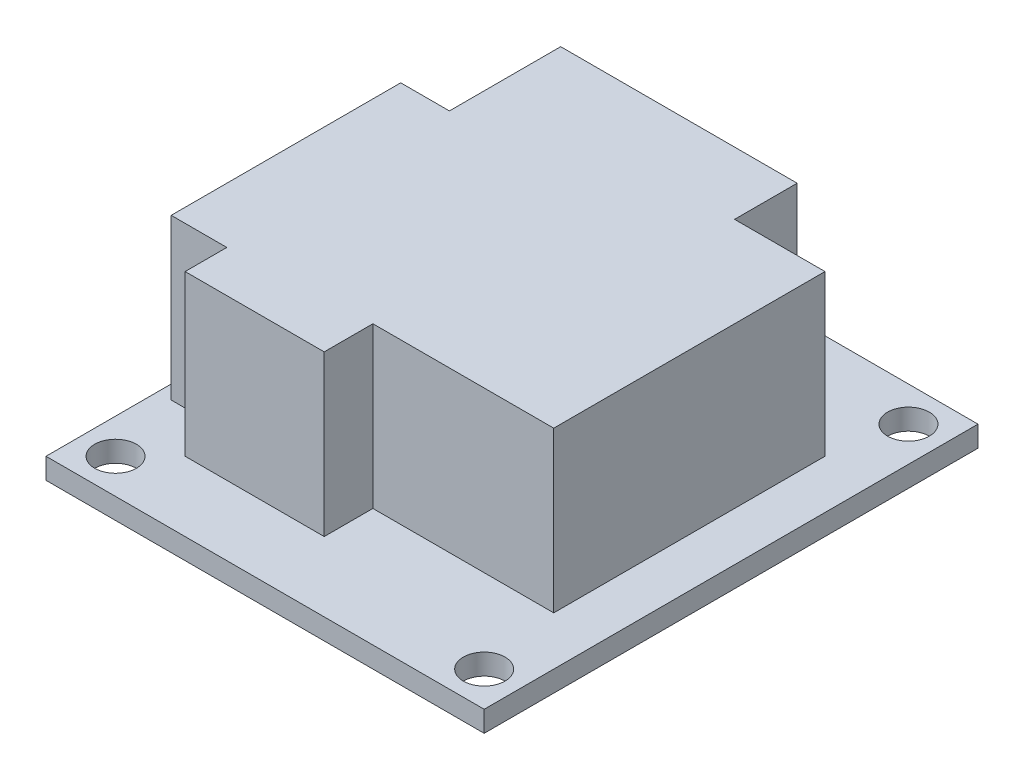
ISO-10303-21;
HEADER;
FILE_DESCRIPTION(('STEP AP214'),'2;1');
FILE_NAME('part.step','',(''),(''),'','','');
FILE_SCHEMA(('AUTOMOTIVE_DESIGN { 1 0 10303 214 1 1 1 1 }'));
ENDSEC;
DATA;
#1=APPLICATION_CONTEXT('core data for automotive mechanical design processes');
#2=APPLICATION_PROTOCOL_DEFINITION('international standard','automotive_design',2000,#1);
#3=PRODUCT_CONTEXT('',#1,'mechanical');
#4=PRODUCT('Part','Part','',(#3));
#5=PRODUCT_RELATED_PRODUCT_CATEGORY('part','',(#4));
#6=PRODUCT_DEFINITION_FORMATION('','',#4);
#7=PRODUCT_DEFINITION_CONTEXT('part definition',#1,'design');
#8=PRODUCT_DEFINITION('design','',#6,#7);
#9=PRODUCT_DEFINITION_SHAPE('','',#8);
#10=(LENGTH_UNIT() NAMED_UNIT(*) SI_UNIT(.MILLI.,.METRE.));
#11=(NAMED_UNIT(*) PLANE_ANGLE_UNIT() SI_UNIT($,.RADIAN.));
#12=(NAMED_UNIT(*) SI_UNIT($,.STERADIAN.) SOLID_ANGLE_UNIT());
#13=UNCERTAINTY_MEASURE_WITH_UNIT(LENGTH_MEASURE(1.E-05),#10,'distance_accuracy_value','');
#14=(GEOMETRIC_REPRESENTATION_CONTEXT(3) GLOBAL_UNCERTAINTY_ASSIGNED_CONTEXT((#13)) GLOBAL_UNIT_ASSIGNED_CONTEXT((#10,
#11,#12)) REPRESENTATION_CONTEXT('',''));
#15=CARTESIAN_POINT('',(0.,0.,0.));
#16=DIRECTION('',(0.,0.,1.));
#17=DIRECTION('',(1.,0.,0.));
#18=AXIS2_PLACEMENT_3D('',#15,#16,#17);
#19=CARTESIAN_POINT('',(0.,0.,0.));
#20=DIRECTION('',(0.,1.,0.));
#21=DIRECTION('',(0.,0.,1.));
#22=AXIS2_PLACEMENT_3D('',#19,#20,#21);
#23=PLANE('',#22);
#24=DIRECTION('',(0.,0.,-1.));
#25=VECTOR('',#24,1.);
#26=CARTESIAN_POINT('',(-14.245744305368,0.,0.));
#27=LINE('',#26,#25);
#28=CARTESIAN_POINT('',(-14.245744305368,0.,45.3495673691751));
#29=VERTEX_POINT('',#28);
#30=CARTESIAN_POINT('',(-14.245744305368,0.,9.84956736917511));
#31=VERTEX_POINT('',#30);
#32=EDGE_CURVE('E470',#29,#31,#27,.T.);
#33=ORIENTED_EDGE('',*,*,#32,.T.);
#34=DIRECTION('',(-1.,0.,0.));
#35=VECTOR('',#34,1.);
#36=CARTESIAN_POINT('',(0.,0.,9.8495673691751));
#37=LINE('',#36,#35);
#38=CARTESIAN_POINT('',(17.254255694632,0.,9.84956736917509));
#39=VERTEX_POINT('',#38);
#40=EDGE_CURVE('E438',#39,#31,#37,.T.);
#41=ORIENTED_EDGE('',*,*,#40,.F.);
#42=DIRECTION('',(0.,0.,-1.));
#43=VECTOR('',#42,1.);
#44=CARTESIAN_POINT('',(17.254255694632,0.,0.));
#45=LINE('',#44,#43);
#46=CARTESIAN_POINT('',(17.254255694632,0.,45.3495673691751));
#47=VERTEX_POINT('',#46);
#48=EDGE_CURVE('E476',#47,#39,#45,.T.);
#49=ORIENTED_EDGE('',*,*,#48,.F.);
#50=DIRECTION('',(-1.,0.,0.));
#51=VECTOR('',#50,1.);
#52=CARTESIAN_POINT('',(0.,0.,45.3495673691751));
#53=LINE('',#52,#51);
#54=EDGE_CURVE('E473',#47,#29,#53,.T.);
#55=ORIENTED_EDGE('',*,*,#54,.T.);
#56=EDGE_LOOP('',(#33,#41,#49,#55));
#57=FACE_BOUND('',#56,.T.);
#58=CARTESIAN_POINT('',(14.754255694632,0.,12.3495673691751));
#59=DIRECTION('',(0.,1.,0.));
#60=DIRECTION('',(0.,0.,1.));
#61=AXIS2_PLACEMENT_3D('',#58,#59,#60);
#62=CIRCLE('',#61,1.5);
#63=CARTESIAN_POINT('',(14.754255694632,0.,13.8495673691751));
#64=VERTEX_POINT('',#63);
#65=EDGE_CURVE('E467',#64,#64,#62,.T.);
#66=ORIENTED_EDGE('',*,*,#65,.T.);
#67=EDGE_LOOP('',(#66));
#68=FACE_BOUND('',#67,.T.);
#69=CARTESIAN_POINT('',(-11.745744305368,0.,12.3495673691751));
#70=DIRECTION('',(0.,1.,0.));
#71=DIRECTION('',(0.,0.,1.));
#72=AXIS2_PLACEMENT_3D('',#69,#70,#71);
#73=CIRCLE('',#72,1.5);
#74=CARTESIAN_POINT('',(-11.745744305368,0.,13.8495673691751));
#75=VERTEX_POINT('',#74);
#76=EDGE_CURVE('E464',#75,#75,#73,.T.);
#77=ORIENTED_EDGE('',*,*,#76,.T.);
#78=EDGE_LOOP('',(#77));
#79=FACE_BOUND('',#78,.T.);
#80=CARTESIAN_POINT('',(-11.745744305368,0.,42.8495673691751));
#81=DIRECTION('',(0.,1.,0.));
#82=DIRECTION('',(0.,0.,1.));
#83=AXIS2_PLACEMENT_3D('',#80,#81,#82);
#84=CIRCLE('',#83,1.5);
#85=CARTESIAN_POINT('',(-11.745744305368,0.,44.3495673691751));
#86=VERTEX_POINT('',#85);
#87=EDGE_CURVE('E461',#86,#86,#84,.T.);
#88=ORIENTED_EDGE('',*,*,#87,.T.);
#89=EDGE_LOOP('',(#88));
#90=FACE_BOUND('',#89,.T.);
#91=CARTESIAN_POINT('',(14.754255694632,0.,42.8495673691751));
#92=DIRECTION('',(0.,1.,0.));
#93=DIRECTION('',(0.,0.,1.));
#94=AXIS2_PLACEMENT_3D('',#91,#92,#93);
#95=CIRCLE('',#94,1.5);
#96=CARTESIAN_POINT('',(14.754255694632,0.,44.3495673691751));
#97=VERTEX_POINT('',#96);
#98=EDGE_CURVE('E433',#97,#97,#95,.T.);
#99=ORIENTED_EDGE('',*,*,#98,.T.);
#100=EDGE_LOOP('',(#99));
#101=FACE_BOUND('',#100,.T.);
#102=DIRECTION('',(1.,0.,0.));
#103=VECTOR('',#102,1.);
#104=CARTESIAN_POINT('',(0.,0.,20.8495673691751));
#105=LINE('',#104,#103);
#106=CARTESIAN_POINT('',(-13.245744305368,0.,20.8495673691751));
#107=VERTEX_POINT('',#106);
#108=CARTESIAN_POINT('',(-9.745744305368,0.,20.8495673691751));
#109=VERTEX_POINT('',#108);
#110=EDGE_CURVE('E56',#107,#109,#105,.T.);
#111=ORIENTED_EDGE('',*,*,#110,.F.);
#112=DIRECTION('',(0.,0.,-1.));
#113=VECTOR('',#112,1.);
#114=CARTESIAN_POINT('',(-13.245744305368,0.,0.));
#115=LINE('',#114,#113);
#116=CARTESIAN_POINT('',(-13.245744305368,0.,37.3495673691751));
#117=VERTEX_POINT('',#116);
#118=EDGE_CURVE('E60',#117,#107,#115,.T.);
#119=ORIENTED_EDGE('',*,*,#118,.F.);
#120=DIRECTION('',(-1.,0.,0.));
#121=VECTOR('',#120,1.);
#122=CARTESIAN_POINT('',(0.,0.,37.3495673691751));
#123=LINE('',#122,#121);
#124=CARTESIAN_POINT('',(-9.245744305368,0.,37.3495673691751));
#125=VERTEX_POINT('',#124);
#126=EDGE_CURVE('E271',#125,#117,#123,.T.);
#127=ORIENTED_EDGE('',*,*,#126,.F.);
#128=DIRECTION('',(0.,0.,-1.));
#129=VECTOR('',#128,1.);
#130=CARTESIAN_POINT('',(-9.245744305368,0.,0.));
#131=LINE('',#130,#129);
#132=CARTESIAN_POINT('',(-9.245744305368,0.,40.3495673691751));
#133=VERTEX_POINT('',#132);
#134=EDGE_CURVE('E273',#133,#125,#131,.T.);
#135=ORIENTED_EDGE('',*,*,#134,.F.);
#136=DIRECTION('',(-1.,0.,0.));
#137=VECTOR('',#136,1.);
#138=CARTESIAN_POINT('',(0.,0.,40.3495673691751));
#139=LINE('',#138,#137);
#140=CARTESIAN_POINT('',(0.754255694631998,0.,40.3495673691751));
#141=VERTEX_POINT('',#140);
#142=EDGE_CURVE('E276',#141,#133,#139,.T.);
#143=ORIENTED_EDGE('',*,*,#142,.F.);
#144=DIRECTION('',(0.,0.,1.));
#145=VECTOR('',#144,1.);
#146=CARTESIAN_POINT('',(0.754255694631993,0.,0.));
#147=LINE('',#146,#145);
#148=CARTESIAN_POINT('',(0.754255694631998,0.,36.8495673691751));
#149=VERTEX_POINT('',#148);
#150=EDGE_CURVE('E279',#149,#141,#147,.T.);
#151=ORIENTED_EDGE('',*,*,#150,.F.);
#152=DIRECTION('',(-1.,0.,0.));
#153=VECTOR('',#152,1.);
#154=CARTESIAN_POINT('',(0.,0.,36.8495673691751));
#155=LINE('',#154,#153);
#156=CARTESIAN_POINT('',(13.754255694632,0.,36.8495673691751));
#157=VERTEX_POINT('',#156);
#158=EDGE_CURVE('E282',#157,#149,#155,.T.);
#159=ORIENTED_EDGE('',*,*,#158,.F.);
#160=DIRECTION('',(0.,0.,1.));
#161=VECTOR('',#160,1.);
#162=CARTESIAN_POINT('',(13.754255694632,0.,0.));
#163=LINE('',#162,#161);
#164=CARTESIAN_POINT('',(13.754255694632,0.,17.3495673691751));
#165=VERTEX_POINT('',#164);
#166=EDGE_CURVE('E285',#165,#157,#163,.T.);
#167=ORIENTED_EDGE('',*,*,#166,.F.);
#168=DIRECTION('',(1.,0.,0.));
#169=VECTOR('',#168,1.);
#170=CARTESIAN_POINT('',(0.,0.,17.3495673691751));
#171=LINE('',#170,#169);
#172=CARTESIAN_POINT('',(7.254255694632,0.,17.3495673691751));
#173=VERTEX_POINT('',#172);
#174=EDGE_CURVE('E288',#173,#165,#171,.T.);
#175=ORIENTED_EDGE('',*,*,#174,.F.);
#176=DIRECTION('',(0.,0.,1.));
#177=VECTOR('',#176,1.);
#178=CARTESIAN_POINT('',(7.254255694632,0.,0.));
#179=LINE('',#178,#177);
#180=CARTESIAN_POINT('',(7.254255694632,0.,12.8495673691751));
#181=VERTEX_POINT('',#180);
#182=EDGE_CURVE('E291',#181,#173,#179,.T.);
#183=ORIENTED_EDGE('',*,*,#182,.F.);
#184=DIRECTION('',(1.,0.,0.));
#185=VECTOR('',#184,1.);
#186=CARTESIAN_POINT('',(0.,0.,12.8495673691751));
#187=LINE('',#186,#185);
#188=CARTESIAN_POINT('',(-9.745744305368,0.,12.8495673691751));
#189=VERTEX_POINT('',#188);
#190=EDGE_CURVE('E248',#189,#181,#187,.T.);
#191=ORIENTED_EDGE('',*,*,#190,.F.);
#192=DIRECTION('',(0.,0.,-1.));
#193=VECTOR('',#192,1.);
#194=CARTESIAN_POINT('',(-9.745744305368,0.,0.));
#195=LINE('',#194,#193);
#196=EDGE_CURVE('E245',#109,#189,#195,.T.);
#197=ORIENTED_EDGE('',*,*,#196,.F.);
#198=EDGE_LOOP('',(#111,#119,#127,#135,#143,#151,#159,#167,#175,#183,#191,#197));
#199=FACE_BOUND('',#198,.T.);
#200=ADVANCED_FACE('F41',(#57,#68,#79,#90,#101,#199),#23,.F.);
#201=CARTESIAN_POINT('',(-14.245744305368,1.5,0.));
#202=DIRECTION('',(-1.,0.,0.));
#203=DIRECTION('',(0.,0.,1.));
#204=AXIS2_PLACEMENT_3D('',#201,#202,#203);
#205=PLANE('',#204);
#206=ORIENTED_EDGE('',*,*,#32,.F.);
#207=DIRECTION('',(0.,-1.,0.));
#208=VECTOR('',#207,1.);
#209=CARTESIAN_POINT('',(-14.245744305368,1.5,45.3495673691751));
#210=LINE('',#209,#208);
#211=CARTESIAN_POINT('',(-14.245744305368,1.5,45.3495673691751));
#212=VERTEX_POINT('',#211);
#213=EDGE_CURVE('E11',#212,#29,#210,.T.);
#214=ORIENTED_EDGE('',*,*,#213,.F.);
#215=DIRECTION('',(0.,0.,-1.));
#216=VECTOR('',#215,1.);
#217=CARTESIAN_POINT('',(-14.245744305368,1.5,0.));
#218=LINE('',#217,#216);
#219=CARTESIAN_POINT('',(-14.245744305368,1.5,9.84956736917511));
#220=VERTEX_POINT('',#219);
#221=EDGE_CURVE('E447',#212,#220,#218,.T.);
#222=ORIENTED_EDGE('',*,*,#221,.T.);
#223=DIRECTION('',(0.,-1.,0.));
#224=VECTOR('',#223,1.);
#225=CARTESIAN_POINT('',(-14.245744305368,1.5,9.84956736917511));
#226=LINE('',#225,#224);
#227=EDGE_CURVE('E458',#220,#31,#226,.T.);
#228=ORIENTED_EDGE('',*,*,#227,.T.);
#229=EDGE_LOOP('',(#206,#214,#222,#228));
#230=FACE_BOUND('',#229,.T.);
#231=ADVANCED_FACE('F498',(#230),#205,.T.);
#232=CARTESIAN_POINT('',(0.,1.5,45.3495673691751));
#233=DIRECTION('',(0.,0.,1.));
#234=DIRECTION('',(1.,0.,0.));
#235=AXIS2_PLACEMENT_3D('',#232,#233,#234);
#236=PLANE('',#235);
#237=ORIENTED_EDGE('',*,*,#54,.F.);
#238=DIRECTION('',(0.,-1.,0.));
#239=VECTOR('',#238,1.);
#240=CARTESIAN_POINT('',(17.254255694632,1.5,45.3495673691751));
#241=LINE('',#240,#239);
#242=CARTESIAN_POINT('',(17.254255694632,1.5,45.3495673691751));
#243=VERTEX_POINT('',#242);
#244=EDGE_CURVE('E49',#243,#47,#241,.T.);
#245=ORIENTED_EDGE('',*,*,#244,.F.);
#246=DIRECTION('',(-1.,0.,0.));
#247=VECTOR('',#246,1.);
#248=CARTESIAN_POINT('',(0.,1.5,45.3495673691751));
#249=LINE('',#248,#247);
#250=EDGE_CURVE('E450',#243,#212,#249,.T.);
#251=ORIENTED_EDGE('',*,*,#250,.T.);
#252=ORIENTED_EDGE('',*,*,#213,.T.);
#253=EDGE_LOOP('',(#237,#245,#251,#252));
#254=FACE_BOUND('',#253,.T.);
#255=ADVANCED_FACE('F494',(#254),#236,.T.);
#256=CARTESIAN_POINT('',(17.254255694632,1.5,0.));
#257=DIRECTION('',(-1.,0.,0.));
#258=DIRECTION('',(0.,0.,1.));
#259=AXIS2_PLACEMENT_3D('',#256,#257,#258);
#260=PLANE('',#259);
#261=ORIENTED_EDGE('',*,*,#48,.T.);
#262=DIRECTION('',(0.,-1.,0.));
#263=VECTOR('',#262,1.);
#264=CARTESIAN_POINT('',(17.254255694632,1.5,9.84956736917509));
#265=LINE('',#264,#263);
#266=CARTESIAN_POINT('',(17.254255694632,1.5,9.84956736917509));
#267=VERTEX_POINT('',#266);
#268=EDGE_CURVE('E482',#267,#39,#265,.T.);
#269=ORIENTED_EDGE('',*,*,#268,.F.);
#270=DIRECTION('',(0.,0.,-1.));
#271=VECTOR('',#270,1.);
#272=CARTESIAN_POINT('',(17.254255694632,1.5,0.));
#273=LINE('',#272,#271);
#274=EDGE_CURVE('E453',#243,#267,#273,.T.);
#275=ORIENTED_EDGE('',*,*,#274,.F.);
#276=ORIENTED_EDGE('',*,*,#244,.T.);
#277=EDGE_LOOP('',(#261,#269,#275,#276));
#278=FACE_BOUND('',#277,.T.);
#279=ADVANCED_FACE('F487',(#278),#260,.F.);
#280=CARTESIAN_POINT('',(14.754255694632,1.5,12.3495673691751));
#281=DIRECTION('',(0.,-1.,0.));
#282=DIRECTION('',(0.,0.,-1.));
#283=AXIS2_PLACEMENT_3D('',#280,#281,#282);
#284=CYLINDRICAL_SURFACE('',#283,1.5);
#285=CARTESIAN_POINT('',(14.754255694632,1.5,12.3495673691751));
#286=DIRECTION('',(0.,1.,0.));
#287=DIRECTION('',(0.,0.,1.));
#288=AXIS2_PLACEMENT_3D('',#285,#286,#287);
#289=CIRCLE('',#288,1.5);
#290=CARTESIAN_POINT('',(14.754255694632,1.5,13.8495673691751));
#291=VERTEX_POINT('',#290);
#292=EDGE_CURVE('E444',#291,#291,#289,.T.);
#293=ORIENTED_EDGE('',*,*,#292,.T.);
#294=EDGE_LOOP('',(#293));
#295=FACE_BOUND('',#294,.T.);
#296=ORIENTED_EDGE('',*,*,#65,.F.);
#297=EDGE_LOOP('',(#296));
#298=FACE_BOUND('',#297,.T.);
#299=ADVANCED_FACE('F528',(#295,#298),#284,.F.);
#300=CARTESIAN_POINT('',(-11.745744305368,1.5,12.3495673691751));
#301=DIRECTION('',(0.,-1.,0.));
#302=DIRECTION('',(0.,0.,-1.));
#303=AXIS2_PLACEMENT_3D('',#300,#301,#302);
#304=CYLINDRICAL_SURFACE('',#303,1.5);
#305=CARTESIAN_POINT('',(-11.745744305368,1.5,12.3495673691751));
#306=DIRECTION('',(0.,1.,0.));
#307=DIRECTION('',(0.,0.,1.));
#308=AXIS2_PLACEMENT_3D('',#305,#306,#307);
#309=CIRCLE('',#308,1.5);
#310=CARTESIAN_POINT('',(-11.745744305368,1.5,13.8495673691751));
#311=VERTEX_POINT('',#310);
#312=EDGE_CURVE('E441',#311,#311,#309,.T.);
#313=ORIENTED_EDGE('',*,*,#312,.T.);
#314=EDGE_LOOP('',(#313));
#315=FACE_BOUND('',#314,.T.);
#316=ORIENTED_EDGE('',*,*,#76,.F.);
#317=EDGE_LOOP('',(#316));
#318=FACE_BOUND('',#317,.T.);
#319=ADVANCED_FACE('F533',(#315,#318),#304,.F.);
#320=CARTESIAN_POINT('',(-11.745744305368,1.5,42.8495673691751));
#321=DIRECTION('',(0.,-1.,0.));
#322=DIRECTION('',(0.,0.,-1.));
#323=AXIS2_PLACEMENT_3D('',#320,#321,#322);
#324=CYLINDRICAL_SURFACE('',#323,1.5);
#325=CARTESIAN_POINT('',(-11.745744305368,1.5,42.8495673691751));
#326=DIRECTION('',(0.,1.,0.));
#327=DIRECTION('',(0.,0.,1.));
#328=AXIS2_PLACEMENT_3D('',#325,#326,#327);
#329=CIRCLE('',#328,1.5);
#330=CARTESIAN_POINT('',(-11.745744305368,1.5,44.3495673691751));
#331=VERTEX_POINT('',#330);
#332=EDGE_CURVE('E437',#331,#331,#329,.T.);
#333=ORIENTED_EDGE('',*,*,#332,.T.);
#334=EDGE_LOOP('',(#333));
#335=FACE_BOUND('',#334,.T.);
#336=ORIENTED_EDGE('',*,*,#87,.F.);
#337=EDGE_LOOP('',(#336));
#338=FACE_BOUND('',#337,.T.);
#339=ADVANCED_FACE('F536',(#335,#338),#324,.F.);
#340=CARTESIAN_POINT('',(14.754255694632,1.5,42.8495673691751));
#341=DIRECTION('',(0.,-1.,0.));
#342=DIRECTION('',(0.,0.,-1.));
#343=AXIS2_PLACEMENT_3D('',#340,#341,#342);
#344=CYLINDRICAL_SURFACE('',#343,1.5);
#345=CARTESIAN_POINT('',(14.754255694632,1.5,42.8495673691751));
#346=DIRECTION('',(0.,1.,0.));
#347=DIRECTION('',(0.,0.,1.));
#348=AXIS2_PLACEMENT_3D('',#345,#346,#347);
#349=CIRCLE('',#348,1.5);
#350=CARTESIAN_POINT('',(14.754255694632,1.5,44.3495673691751));
#351=VERTEX_POINT('',#350);
#352=EDGE_CURVE('E434',#351,#351,#349,.T.);
#353=ORIENTED_EDGE('',*,*,#352,.T.);
#354=EDGE_LOOP('',(#353));
#355=FACE_BOUND('',#354,.T.);
#356=ORIENTED_EDGE('',*,*,#98,.F.);
#357=EDGE_LOOP('',(#356));
#358=FACE_BOUND('',#357,.T.);
#359=ADVANCED_FACE('F43',(#355,#358),#344,.F.);
#360=CARTESIAN_POINT('',(0.,1.5,9.8495673691751));
#361=DIRECTION('',(0.,0.,1.));
#362=DIRECTION('',(1.,0.,0.));
#363=AXIS2_PLACEMENT_3D('',#360,#361,#362);
#364=PLANE('',#363);
#365=ORIENTED_EDGE('',*,*,#40,.T.);
#366=ORIENTED_EDGE('',*,*,#227,.F.);
#367=DIRECTION('',(-1.,0.,0.));
#368=VECTOR('',#367,1.);
#369=CARTESIAN_POINT('',(0.,1.5,9.8495673691751));
#370=LINE('',#369,#368);
#371=EDGE_CURVE('E456',#267,#220,#370,.T.);
#372=ORIENTED_EDGE('',*,*,#371,.F.);
#373=ORIENTED_EDGE('',*,*,#268,.T.);
#374=EDGE_LOOP('',(#365,#366,#372,#373));
#375=FACE_BOUND('',#374,.T.);
#376=ADVANCED_FACE('F501',(#375),#364,.F.);
#377=CARTESIAN_POINT('',(0.,1.5,0.));
#378=DIRECTION('',(0.,1.,0.));
#379=DIRECTION('',(0.,0.,1.));
#380=AXIS2_PLACEMENT_3D('',#377,#378,#379);
#381=PLANE('',#380);
#382=DIRECTION('',(-1.,0.,0.));
#383=VECTOR('',#382,1.);
#384=CARTESIAN_POINT('',(0.,1.5,20.8495673691751));
#385=LINE('',#384,#383);
#386=CARTESIAN_POINT('',(-9.745744305368,1.5,20.8495673691751));
#387=VERTEX_POINT('',#386);
#388=CARTESIAN_POINT('',(-13.245744305368,1.5,20.8495673691751));
#389=VERTEX_POINT('',#388);
#390=EDGE_CURVE('E430',#387,#389,#385,.T.);
#391=ORIENTED_EDGE('',*,*,#390,.F.);
#392=DIRECTION('',(0.,0.,1.));
#393=VECTOR('',#392,1.);
#394=CARTESIAN_POINT('',(-9.745744305368,1.5,0.));
#395=LINE('',#394,#393);
#396=CARTESIAN_POINT('',(-9.745744305368,1.5,12.8495673691751));
#397=VERTEX_POINT('',#396);
#398=EDGE_CURVE('E397',#397,#387,#395,.T.);
#399=ORIENTED_EDGE('',*,*,#398,.F.);
#400=DIRECTION('',(-1.,0.,0.));
#401=VECTOR('',#400,1.);
#402=CARTESIAN_POINT('',(0.,1.5,12.8495673691751));
#403=LINE('',#402,#401);
#404=CARTESIAN_POINT('',(7.254255694632,1.5,12.8495673691751));
#405=VERTEX_POINT('',#404);
#406=EDGE_CURVE('E400',#405,#397,#403,.T.);
#407=ORIENTED_EDGE('',*,*,#406,.F.);
#408=DIRECTION('',(0.,0.,-1.));
#409=VECTOR('',#408,1.);
#410=CARTESIAN_POINT('',(7.254255694632,1.5,0.));
#411=LINE('',#410,#409);
#412=CARTESIAN_POINT('',(7.254255694632,1.5,17.3495673691751));
#413=VERTEX_POINT('',#412);
#414=EDGE_CURVE('E403',#413,#405,#411,.T.);
#415=ORIENTED_EDGE('',*,*,#414,.F.);
#416=DIRECTION('',(-1.,0.,0.));
#417=VECTOR('',#416,1.);
#418=CARTESIAN_POINT('',(0.,1.5,17.3495673691751));
#419=LINE('',#418,#417);
#420=CARTESIAN_POINT('',(13.754255694632,1.5,17.3495673691751));
#421=VERTEX_POINT('',#420);
#422=EDGE_CURVE('E406',#421,#413,#419,.T.);
#423=ORIENTED_EDGE('',*,*,#422,.F.);
#424=DIRECTION('',(0.,0.,-1.));
#425=VECTOR('',#424,1.);
#426=CARTESIAN_POINT('',(13.754255694632,1.5,0.));
#427=LINE('',#426,#425);
#428=CARTESIAN_POINT('',(13.754255694632,1.5,36.8495673691751));
#429=VERTEX_POINT('',#428);
#430=EDGE_CURVE('E409',#429,#421,#427,.T.);
#431=ORIENTED_EDGE('',*,*,#430,.F.);
#432=DIRECTION('',(1.,0.,0.));
#433=VECTOR('',#432,1.);
#434=CARTESIAN_POINT('',(0.,1.5,36.8495673691751));
#435=LINE('',#434,#433);
#436=CARTESIAN_POINT('',(0.754255694631998,1.5,36.8495673691751));
#437=VERTEX_POINT('',#436);
#438=EDGE_CURVE('E412',#437,#429,#435,.T.);
#439=ORIENTED_EDGE('',*,*,#438,.F.);
#440=DIRECTION('',(0.,0.,-1.));
#441=VECTOR('',#440,1.);
#442=CARTESIAN_POINT('',(0.754255694631993,1.5,0.));
#443=LINE('',#442,#441);
#444=CARTESIAN_POINT('',(0.754255694631998,1.5,40.3495673691751));
#445=VERTEX_POINT('',#444);
#446=EDGE_CURVE('E415',#445,#437,#443,.T.);
#447=ORIENTED_EDGE('',*,*,#446,.F.);
#448=DIRECTION('',(1.,0.,0.));
#449=VECTOR('',#448,1.);
#450=CARTESIAN_POINT('',(0.,1.5,40.3495673691751));
#451=LINE('',#450,#449);
#452=CARTESIAN_POINT('',(-9.245744305368,1.5,40.3495673691751));
#453=VERTEX_POINT('',#452);
#454=EDGE_CURVE('E418',#453,#445,#451,.T.);
#455=ORIENTED_EDGE('',*,*,#454,.F.);
#456=DIRECTION('',(0.,0.,1.));
#457=VECTOR('',#456,1.);
#458=CARTESIAN_POINT('',(-9.245744305368,1.5,0.));
#459=LINE('',#458,#457);
#460=CARTESIAN_POINT('',(-9.245744305368,1.5,37.3495673691751));
#461=VERTEX_POINT('',#460);
#462=EDGE_CURVE('E421',#461,#453,#459,.T.);
#463=ORIENTED_EDGE('',*,*,#462,.F.);
#464=DIRECTION('',(1.,0.,0.));
#465=VECTOR('',#464,1.);
#466=CARTESIAN_POINT('',(0.,1.5,37.3495673691751));
#467=LINE('',#466,#465);
#468=CARTESIAN_POINT('',(-13.245744305368,1.5,37.3495673691751));
#469=VERTEX_POINT('',#468);
#470=EDGE_CURVE('E424',#469,#461,#467,.T.);
#471=ORIENTED_EDGE('',*,*,#470,.F.);
#472=DIRECTION('',(0.,0.,1.));
#473=VECTOR('',#472,1.);
#474=CARTESIAN_POINT('',(-13.245744305368,1.5,0.));
#475=LINE('',#474,#473);
#476=EDGE_CURVE('E427',#389,#469,#475,.T.);
#477=ORIENTED_EDGE('',*,*,#476,.F.);
#478=EDGE_LOOP('',(#391,#399,#407,#415,#423,#431,#439,#447,#455,#463,#471,#477));
#479=FACE_BOUND('',#478,.T.);
#480=ORIENTED_EDGE('',*,*,#352,.F.);
#481=EDGE_LOOP('',(#480));
#482=FACE_BOUND('',#481,.T.);
#483=ORIENTED_EDGE('',*,*,#332,.F.);
#484=EDGE_LOOP('',(#483));
#485=FACE_BOUND('',#484,.T.);
#486=ORIENTED_EDGE('',*,*,#312,.F.);
#487=EDGE_LOOP('',(#486));
#488=FACE_BOUND('',#487,.T.);
#489=ORIENTED_EDGE('',*,*,#292,.F.);
#490=EDGE_LOOP('',(#489));
#491=FACE_BOUND('',#490,.T.);
#492=ORIENTED_EDGE('',*,*,#221,.F.);
#493=ORIENTED_EDGE('',*,*,#250,.F.);
#494=ORIENTED_EDGE('',*,*,#274,.T.);
#495=ORIENTED_EDGE('',*,*,#371,.T.);
#496=EDGE_LOOP('',(#492,#493,#494,#495));
#497=FACE_BOUND('',#496,.T.);
#498=ADVANCED_FACE('F503',(#479,#482,#485,#488,#491,#497),#381,.T.);
#499=CARTESIAN_POINT('',(0.,13.,20.8495673691751));
#500=DIRECTION('',(0.,0.,-1.));
#501=DIRECTION('',(-1.,0.,0.));
#502=AXIS2_PLACEMENT_3D('',#499,#500,#501);
#503=PLANE('',#502);
#504=DIRECTION('',(0.,-1.,0.));
#505=VECTOR('',#504,1.);
#506=CARTESIAN_POINT('',(-9.745744305368,13.,20.8495673691751));
#507=LINE('',#506,#505);
#508=CARTESIAN_POINT('',(-9.745744305368,13.,20.8495673691751));
#509=VERTEX_POINT('',#508);
#510=EDGE_CURVE('E361',#509,#387,#507,.T.);
#511=ORIENTED_EDGE('',*,*,#510,.T.);
#512=ORIENTED_EDGE('',*,*,#390,.T.);
#513=DIRECTION('',(0.,-1.,0.));
#514=VECTOR('',#513,1.);
#515=CARTESIAN_POINT('',(-13.245744305368,13.,20.8495673691751));
#516=LINE('',#515,#514);
#517=CARTESIAN_POINT('',(-13.245744305368,13.,20.8495673691751));
#518=VERTEX_POINT('',#517);
#519=EDGE_CURVE('E394',#518,#389,#516,.T.);
#520=ORIENTED_EDGE('',*,*,#519,.F.);
#521=DIRECTION('',(1.,0.,0.));
#522=VECTOR('',#521,1.);
#523=CARTESIAN_POINT('',(0.,13.,20.8495673691751));
#524=LINE('',#523,#522);
#525=EDGE_CURVE('E297',#518,#509,#524,.T.);
#526=ORIENTED_EDGE('',*,*,#525,.T.);
#527=EDGE_LOOP('',(#511,#512,#520,#526));
#528=FACE_BOUND('',#527,.T.);
#529=ADVANCED_FACE('F505',(#528),#503,.T.);
#530=CARTESIAN_POINT('',(-13.245744305368,13.,0.));
#531=DIRECTION('',(-1.,0.,0.));
#532=DIRECTION('',(0.,0.,1.));
#533=AXIS2_PLACEMENT_3D('',#530,#531,#532);
#534=PLANE('',#533);
#535=ORIENTED_EDGE('',*,*,#519,.T.);
#536=ORIENTED_EDGE('',*,*,#476,.T.);
#537=DIRECTION('',(0.,-1.,0.));
#538=VECTOR('',#537,1.);
#539=CARTESIAN_POINT('',(-13.245744305368,13.,37.3495673691751));
#540=LINE('',#539,#538);
#541=CARTESIAN_POINT('',(-13.245744305368,13.,37.3495673691751));
#542=VERTEX_POINT('',#541);
#543=EDGE_CURVE('E391',#542,#469,#540,.T.);
#544=ORIENTED_EDGE('',*,*,#543,.F.);
#545=DIRECTION('',(0.,0.,-1.));
#546=VECTOR('',#545,1.);
#547=CARTESIAN_POINT('',(-13.245744305368,13.,0.));
#548=LINE('',#547,#546);
#549=EDGE_CURVE('E328',#542,#518,#548,.T.);
#550=ORIENTED_EDGE('',*,*,#549,.T.);
#551=EDGE_LOOP('',(#535,#536,#544,#550));
#552=FACE_BOUND('',#551,.T.);
#553=ADVANCED_FACE('F512',(#552),#534,.T.);
#554=CARTESIAN_POINT('',(0.,13.,37.3495673691751));
#555=DIRECTION('',(0.,0.,1.));
#556=DIRECTION('',(1.,0.,0.));
#557=AXIS2_PLACEMENT_3D('',#554,#555,#556);
#558=PLANE('',#557);
#559=ORIENTED_EDGE('',*,*,#543,.T.);
#560=ORIENTED_EDGE('',*,*,#470,.T.);
#561=DIRECTION('',(0.,-1.,0.));
#562=VECTOR('',#561,1.);
#563=CARTESIAN_POINT('',(-9.245744305368,13.,37.3495673691751));
#564=LINE('',#563,#562);
#565=CARTESIAN_POINT('',(-9.245744305368,13.,37.3495673691751));
#566=VERTEX_POINT('',#565);
#567=EDGE_CURVE('E388',#566,#461,#564,.T.);
#568=ORIENTED_EDGE('',*,*,#567,.F.);
#569=DIRECTION('',(-1.,0.,0.));
#570=VECTOR('',#569,1.);
#571=CARTESIAN_POINT('',(0.,13.,37.3495673691751));
#572=LINE('',#571,#570);
#573=EDGE_CURVE('E331',#566,#542,#572,.T.);
#574=ORIENTED_EDGE('',*,*,#573,.T.);
#575=EDGE_LOOP('',(#559,#560,#568,#574));
#576=FACE_BOUND('',#575,.T.);
#577=ADVANCED_FACE('F589',(#576),#558,.T.);
#578=CARTESIAN_POINT('',(-9.245744305368,13.,0.));
#579=DIRECTION('',(-1.,0.,0.));
#580=DIRECTION('',(0.,0.,1.));
#581=AXIS2_PLACEMENT_3D('',#578,#579,#580);
#582=PLANE('',#581);
#583=ORIENTED_EDGE('',*,*,#567,.T.);
#584=ORIENTED_EDGE('',*,*,#462,.T.);
#585=DIRECTION('',(0.,-1.,0.));
#586=VECTOR('',#585,1.);
#587=CARTESIAN_POINT('',(-9.245744305368,13.,40.3495673691751));
#588=LINE('',#587,#586);
#589=CARTESIAN_POINT('',(-9.245744305368,13.,40.3495673691751));
#590=VERTEX_POINT('',#589);
#591=EDGE_CURVE('E385',#590,#453,#588,.T.);
#592=ORIENTED_EDGE('',*,*,#591,.F.);
#593=DIRECTION('',(0.,0.,-1.));
#594=VECTOR('',#593,1.);
#595=CARTESIAN_POINT('',(-9.245744305368,13.,0.));
#596=LINE('',#595,#594);
#597=EDGE_CURVE('E334',#590,#566,#596,.T.);
#598=ORIENTED_EDGE('',*,*,#597,.T.);
#599=EDGE_LOOP('',(#583,#584,#592,#598));
#600=FACE_BOUND('',#599,.T.);
#601=ADVANCED_FACE('F599',(#600),#582,.T.);
#602=CARTESIAN_POINT('',(0.,13.,40.3495673691751));
#603=DIRECTION('',(0.,0.,1.));
#604=DIRECTION('',(1.,0.,0.));
#605=AXIS2_PLACEMENT_3D('',#602,#603,#604);
#606=PLANE('',#605);
#607=ORIENTED_EDGE('',*,*,#591,.T.);
#608=ORIENTED_EDGE('',*,*,#454,.T.);
#609=DIRECTION('',(0.,-1.,0.));
#610=VECTOR('',#609,1.);
#611=CARTESIAN_POINT('',(0.754255694631998,13.,40.3495673691751));
#612=LINE('',#611,#610);
#613=CARTESIAN_POINT('',(0.754255694631998,13.,40.3495673691751));
#614=VERTEX_POINT('',#613);
#615=EDGE_CURVE('E382',#614,#445,#612,.T.);
#616=ORIENTED_EDGE('',*,*,#615,.F.);
#617=DIRECTION('',(-1.,0.,0.));
#618=VECTOR('',#617,1.);
#619=CARTESIAN_POINT('',(0.,13.,40.3495673691751));
#620=LINE('',#619,#618);
#621=EDGE_CURVE('E337',#614,#590,#620,.T.);
#622=ORIENTED_EDGE('',*,*,#621,.T.);
#623=EDGE_LOOP('',(#607,#608,#616,#622));
#624=FACE_BOUND('',#623,.T.);
#625=ADVANCED_FACE('F609',(#624),#606,.T.);
#626=CARTESIAN_POINT('',(0.754255694631993,13.,0.));
#627=DIRECTION('',(1.,0.,0.));
#628=DIRECTION('',(0.,0.,-1.));
#629=AXIS2_PLACEMENT_3D('',#626,#627,#628);
#630=PLANE('',#629);
#631=ORIENTED_EDGE('',*,*,#615,.T.);
#632=ORIENTED_EDGE('',*,*,#446,.T.);
#633=DIRECTION('',(0.,-1.,0.));
#634=VECTOR('',#633,1.);
#635=CARTESIAN_POINT('',(0.754255694631998,13.,36.8495673691751));
#636=LINE('',#635,#634);
#637=CARTESIAN_POINT('',(0.754255694631998,13.,36.8495673691751));
#638=VERTEX_POINT('',#637);
#639=EDGE_CURVE('E379',#638,#437,#636,.T.);
#640=ORIENTED_EDGE('',*,*,#639,.F.);
#641=DIRECTION('',(0.,0.,1.));
#642=VECTOR('',#641,1.);
#643=CARTESIAN_POINT('',(0.754255694631993,13.,0.));
#644=LINE('',#643,#642);
#645=EDGE_CURVE('E340',#638,#614,#644,.T.);
#646=ORIENTED_EDGE('',*,*,#645,.T.);
#647=EDGE_LOOP('',(#631,#632,#640,#646));
#648=FACE_BOUND('',#647,.T.);
#649=ADVANCED_FACE('F619',(#648),#630,.T.);
#650=CARTESIAN_POINT('',(0.,13.,36.8495673691751));
#651=DIRECTION('',(0.,0.,1.));
#652=DIRECTION('',(1.,0.,0.));
#653=AXIS2_PLACEMENT_3D('',#650,#651,#652);
#654=PLANE('',#653);
#655=ORIENTED_EDGE('',*,*,#639,.T.);
#656=ORIENTED_EDGE('',*,*,#438,.T.);
#657=DIRECTION('',(0.,-1.,0.));
#658=VECTOR('',#657,1.);
#659=CARTESIAN_POINT('',(13.754255694632,13.,36.8495673691751));
#660=LINE('',#659,#658);
#661=CARTESIAN_POINT('',(13.754255694632,13.,36.8495673691751));
#662=VERTEX_POINT('',#661);
#663=EDGE_CURVE('E376',#662,#429,#660,.T.);
#664=ORIENTED_EDGE('',*,*,#663,.F.);
#665=DIRECTION('',(-1.,0.,0.));
#666=VECTOR('',#665,1.);
#667=CARTESIAN_POINT('',(0.,13.,36.8495673691751));
#668=LINE('',#667,#666);
#669=EDGE_CURVE('E343',#662,#638,#668,.T.);
#670=ORIENTED_EDGE('',*,*,#669,.T.);
#671=EDGE_LOOP('',(#655,#656,#664,#670));
#672=FACE_BOUND('',#671,.T.);
#673=ADVANCED_FACE('F629',(#672),#654,.T.);
#674=CARTESIAN_POINT('',(13.754255694632,13.,0.));
#675=DIRECTION('',(1.,0.,0.));
#676=DIRECTION('',(0.,0.,-1.));
#677=AXIS2_PLACEMENT_3D('',#674,#675,#676);
#678=PLANE('',#677);
#679=ORIENTED_EDGE('',*,*,#663,.T.);
#680=ORIENTED_EDGE('',*,*,#430,.T.);
#681=DIRECTION('',(0.,-1.,0.));
#682=VECTOR('',#681,1.);
#683=CARTESIAN_POINT('',(13.754255694632,13.,17.3495673691751));
#684=LINE('',#683,#682);
#685=CARTESIAN_POINT('',(13.754255694632,13.,17.3495673691751));
#686=VERTEX_POINT('',#685);
#687=EDGE_CURVE('E373',#686,#421,#684,.T.);
#688=ORIENTED_EDGE('',*,*,#687,.F.);
#689=DIRECTION('',(0.,0.,1.));
#690=VECTOR('',#689,1.);
#691=CARTESIAN_POINT('',(13.754255694632,13.,0.));
#692=LINE('',#691,#690);
#693=EDGE_CURVE('E346',#686,#662,#692,.T.);
#694=ORIENTED_EDGE('',*,*,#693,.T.);
#695=EDGE_LOOP('',(#679,#680,#688,#694));
#696=FACE_BOUND('',#695,.T.);
#697=ADVANCED_FACE('F639',(#696),#678,.T.);
#698=CARTESIAN_POINT('',(0.,13.,17.3495673691751));
#699=DIRECTION('',(0.,0.,-1.));
#700=DIRECTION('',(-1.,0.,0.));
#701=AXIS2_PLACEMENT_3D('',#698,#699,#700);
#702=PLANE('',#701);
#703=ORIENTED_EDGE('',*,*,#687,.T.);
#704=ORIENTED_EDGE('',*,*,#422,.T.);
#705=DIRECTION('',(0.,-1.,0.));
#706=VECTOR('',#705,1.);
#707=CARTESIAN_POINT('',(7.254255694632,13.,17.3495673691751));
#708=LINE('',#707,#706);
#709=CARTESIAN_POINT('',(7.254255694632,13.,17.3495673691751));
#710=VERTEX_POINT('',#709);
#711=EDGE_CURVE('E370',#710,#413,#708,.T.);
#712=ORIENTED_EDGE('',*,*,#711,.F.);
#713=DIRECTION('',(1.,0.,0.));
#714=VECTOR('',#713,1.);
#715=CARTESIAN_POINT('',(0.,13.,17.3495673691751));
#716=LINE('',#715,#714);
#717=EDGE_CURVE('E349',#710,#686,#716,.T.);
#718=ORIENTED_EDGE('',*,*,#717,.T.);
#719=EDGE_LOOP('',(#703,#704,#712,#718));
#720=FACE_BOUND('',#719,.T.);
#721=ADVANCED_FACE('F649',(#720),#702,.T.);
#722=CARTESIAN_POINT('',(7.254255694632,13.,0.));
#723=DIRECTION('',(1.,0.,0.));
#724=DIRECTION('',(0.,0.,-1.));
#725=AXIS2_PLACEMENT_3D('',#722,#723,#724);
#726=PLANE('',#725);
#727=ORIENTED_EDGE('',*,*,#711,.T.);
#728=ORIENTED_EDGE('',*,*,#414,.T.);
#729=DIRECTION('',(0.,-1.,0.));
#730=VECTOR('',#729,1.);
#731=CARTESIAN_POINT('',(7.254255694632,13.,12.8495673691751));
#732=LINE('',#731,#730);
#733=CARTESIAN_POINT('',(7.254255694632,13.,12.8495673691751));
#734=VERTEX_POINT('',#733);
#735=EDGE_CURVE('E367',#734,#405,#732,.T.);
#736=ORIENTED_EDGE('',*,*,#735,.F.);
#737=DIRECTION('',(0.,0.,1.));
#738=VECTOR('',#737,1.);
#739=CARTESIAN_POINT('',(7.254255694632,13.,0.));
#740=LINE('',#739,#738);
#741=EDGE_CURVE('E352',#734,#710,#740,.T.);
#742=ORIENTED_EDGE('',*,*,#741,.T.);
#743=EDGE_LOOP('',(#727,#728,#736,#742));
#744=FACE_BOUND('',#743,.T.);
#745=ADVANCED_FACE('F659',(#744),#726,.T.);
#746=CARTESIAN_POINT('',(0.,13.,12.8495673691751));
#747=DIRECTION('',(0.,0.,-1.));
#748=DIRECTION('',(-1.,0.,0.));
#749=AXIS2_PLACEMENT_3D('',#746,#747,#748);
#750=PLANE('',#749);
#751=ORIENTED_EDGE('',*,*,#735,.T.);
#752=ORIENTED_EDGE('',*,*,#406,.T.);
#753=DIRECTION('',(0.,-1.,0.));
#754=VECTOR('',#753,1.);
#755=CARTESIAN_POINT('',(-9.745744305368,13.,12.8495673691751));
#756=LINE('',#755,#754);
#757=CARTESIAN_POINT('',(-9.745744305368,13.,12.8495673691751));
#758=VERTEX_POINT('',#757);
#759=EDGE_CURVE('E364',#758,#397,#756,.T.);
#760=ORIENTED_EDGE('',*,*,#759,.F.);
#761=DIRECTION('',(1.,0.,0.));
#762=VECTOR('',#761,1.);
#763=CARTESIAN_POINT('',(0.,13.,12.8495673691751));
#764=LINE('',#763,#762);
#765=EDGE_CURVE('E355',#758,#734,#764,.T.);
#766=ORIENTED_EDGE('',*,*,#765,.T.);
#767=EDGE_LOOP('',(#751,#752,#760,#766));
#768=FACE_BOUND('',#767,.T.);
#769=ADVANCED_FACE('F669',(#768),#750,.T.);
#770=CARTESIAN_POINT('',(-9.745744305368,13.,0.));
#771=DIRECTION('',(-1.,0.,0.));
#772=DIRECTION('',(0.,0.,1.));
#773=AXIS2_PLACEMENT_3D('',#770,#771,#772);
#774=PLANE('',#773);
#775=ORIENTED_EDGE('',*,*,#759,.T.);
#776=ORIENTED_EDGE('',*,*,#398,.T.);
#777=ORIENTED_EDGE('',*,*,#510,.F.);
#778=DIRECTION('',(0.,0.,-1.));
#779=VECTOR('',#778,1.);
#780=CARTESIAN_POINT('',(-9.745744305368,13.,0.));
#781=LINE('',#780,#779);
#782=EDGE_CURVE('E358',#509,#758,#781,.T.);
#783=ORIENTED_EDGE('',*,*,#782,.T.);
#784=EDGE_LOOP('',(#775,#776,#777,#783));
#785=FACE_BOUND('',#784,.T.);
#786=ADVANCED_FACE('F679',(#785),#774,.T.);
#787=CARTESIAN_POINT('',(0.,13.,0.));
#788=DIRECTION('',(0.,1.,0.));
#789=DIRECTION('',(0.,0.,1.));
#790=AXIS2_PLACEMENT_3D('',#787,#788,#789);
#791=PLANE('',#790);
#792=ORIENTED_EDGE('',*,*,#525,.F.);
#793=ORIENTED_EDGE('',*,*,#549,.F.);
#794=ORIENTED_EDGE('',*,*,#573,.F.);
#795=ORIENTED_EDGE('',*,*,#597,.F.);
#796=ORIENTED_EDGE('',*,*,#621,.F.);
#797=ORIENTED_EDGE('',*,*,#645,.F.);
#798=ORIENTED_EDGE('',*,*,#669,.F.);
#799=ORIENTED_EDGE('',*,*,#693,.F.);
#800=ORIENTED_EDGE('',*,*,#717,.F.);
#801=ORIENTED_EDGE('',*,*,#741,.F.);
#802=ORIENTED_EDGE('',*,*,#765,.F.);
#803=ORIENTED_EDGE('',*,*,#782,.F.);
#804=EDGE_LOOP('',(#792,#793,#794,#795,#796,#797,#798,#799,#800,#801,#802,#803));
#805=FACE_BOUND('',#804,.T.);
#806=ADVANCED_FACE('F689',(#805),#791,.T.);
#807=CARTESIAN_POINT('',(0.,-1.,20.8495673691751));
#808=DIRECTION('',(0.,0.,1.));
#809=DIRECTION('',(1.,0.,0.));
#810=AXIS2_PLACEMENT_3D('',#807,#808,#809);
#811=PLANE('',#810);
#812=ORIENTED_EDGE('',*,*,#110,.T.);
#813=DIRECTION('',(0.,1.,0.));
#814=VECTOR('',#813,1.);
#815=CARTESIAN_POINT('',(-9.745744305368,-1.,20.8495673691751));
#816=LINE('',#815,#814);
#817=CARTESIAN_POINT('',(-9.745744305368,-1.,20.8495673691751));
#818=VERTEX_POINT('',#817);
#819=EDGE_CURVE('E244',#818,#109,#816,.T.);
#820=ORIENTED_EDGE('',*,*,#819,.F.);
#821=DIRECTION('',(1.,0.,0.));
#822=VECTOR('',#821,1.);
#823=CARTESIAN_POINT('',(0.,-1.,20.8495673691751));
#824=LINE('',#823,#822);
#825=CARTESIAN_POINT('',(-13.245744305368,-1.,20.8495673691751));
#826=VERTEX_POINT('',#825);
#827=EDGE_CURVE('E227',#826,#818,#824,.T.);
#828=ORIENTED_EDGE('',*,*,#827,.F.);
#829=DIRECTION('',(0.,1.,0.));
#830=VECTOR('',#829,1.);
#831=CARTESIAN_POINT('',(-13.245744305368,-1.,20.8495673691751));
#832=LINE('',#831,#830);
#833=EDGE_CURVE('E236',#826,#107,#832,.T.);
#834=ORIENTED_EDGE('',*,*,#833,.T.);
#835=EDGE_LOOP('',(#812,#820,#828,#834));
#836=FACE_BOUND('',#835,.T.);
#837=ADVANCED_FACE('F242',(#836),#811,.F.);
#838=CARTESIAN_POINT('',(-9.745744305368,-1.,0.));
#839=DIRECTION('',(1.,0.,0.));
#840=DIRECTION('',(0.,0.,-1.));
#841=AXIS2_PLACEMENT_3D('',#838,#839,#840);
#842=PLANE('',#841);
#843=ORIENTED_EDGE('',*,*,#196,.T.);
#844=DIRECTION('',(0.,1.,0.));
#845=VECTOR('',#844,1.);
#846=CARTESIAN_POINT('',(-9.745744305368,-1.,12.8495673691751));
#847=LINE('',#846,#845);
#848=CARTESIAN_POINT('',(-9.745744305368,-1.,12.8495673691751));
#849=VERTEX_POINT('',#848);
#850=EDGE_CURVE('E298',#849,#189,#847,.T.);
#851=ORIENTED_EDGE('',*,*,#850,.F.);
#852=DIRECTION('',(0.,0.,-1.));
#853=VECTOR('',#852,1.);
#854=CARTESIAN_POINT('',(-9.745744305368,-1.,0.));
#855=LINE('',#854,#853);
#856=EDGE_CURVE('E240',#818,#849,#855,.T.);
#857=ORIENTED_EDGE('',*,*,#856,.F.);
#858=ORIENTED_EDGE('',*,*,#819,.T.);
#859=EDGE_LOOP('',(#843,#851,#857,#858));
#860=FACE_BOUND('',#859,.T.);
#861=ADVANCED_FACE('F710',(#860),#842,.F.);
#862=CARTESIAN_POINT('',(0.,-1.,12.8495673691751));
#863=DIRECTION('',(0.,0.,1.));
#864=DIRECTION('',(1.,0.,0.));
#865=AXIS2_PLACEMENT_3D('',#862,#863,#864);
#866=PLANE('',#865);
#867=ORIENTED_EDGE('',*,*,#190,.T.);
#868=DIRECTION('',(0.,1.,0.));
#869=VECTOR('',#868,1.);
#870=CARTESIAN_POINT('',(7.254255694632,-1.,12.8495673691751));
#871=LINE('',#870,#869);
#872=CARTESIAN_POINT('',(7.254255694632,-1.,12.8495673691751));
#873=VERTEX_POINT('',#872);
#874=EDGE_CURVE('E301',#873,#181,#871,.T.);
#875=ORIENTED_EDGE('',*,*,#874,.F.);
#876=DIRECTION('',(1.,0.,0.));
#877=VECTOR('',#876,1.);
#878=CARTESIAN_POINT('',(0.,-1.,12.8495673691751));
#879=LINE('',#878,#877);
#880=EDGE_CURVE('E266',#849,#873,#879,.T.);
#881=ORIENTED_EDGE('',*,*,#880,.F.);
#882=ORIENTED_EDGE('',*,*,#850,.T.);
#883=EDGE_LOOP('',(#867,#875,#881,#882));
#884=FACE_BOUND('',#883,.T.);
#885=ADVANCED_FACE('F719',(#884),#866,.F.);
#886=CARTESIAN_POINT('',(7.254255694632,-1.,0.));
#887=DIRECTION('',(-1.,0.,0.));
#888=DIRECTION('',(0.,0.,1.));
#889=AXIS2_PLACEMENT_3D('',#886,#887,#888);
#890=PLANE('',#889);
#891=ORIENTED_EDGE('',*,*,#182,.T.);
#892=DIRECTION('',(0.,1.,0.));
#893=VECTOR('',#892,1.);
#894=CARTESIAN_POINT('',(7.254255694632,-1.,17.3495673691751));
#895=LINE('',#894,#893);
#896=CARTESIAN_POINT('',(7.254255694632,-1.,17.3495673691751));
#897=VERTEX_POINT('',#896);
#898=EDGE_CURVE('E304',#897,#173,#895,.T.);
#899=ORIENTED_EDGE('',*,*,#898,.F.);
#900=DIRECTION('',(0.,0.,1.));
#901=VECTOR('',#900,1.);
#902=CARTESIAN_POINT('',(7.254255694632,-1.,0.));
#903=LINE('',#902,#901);
#904=EDGE_CURVE('E264',#873,#897,#903,.T.);
#905=ORIENTED_EDGE('',*,*,#904,.F.);
#906=ORIENTED_EDGE('',*,*,#874,.T.);
#907=EDGE_LOOP('',(#891,#899,#905,#906));
#908=FACE_BOUND('',#907,.T.);
#909=ADVANCED_FACE('F729',(#908),#890,.F.);
#910=CARTESIAN_POINT('',(0.,-1.,17.3495673691751));
#911=DIRECTION('',(0.,0.,1.));
#912=DIRECTION('',(1.,0.,0.));
#913=AXIS2_PLACEMENT_3D('',#910,#911,#912);
#914=PLANE('',#913);
#915=ORIENTED_EDGE('',*,*,#174,.T.);
#916=DIRECTION('',(0.,1.,0.));
#917=VECTOR('',#916,1.);
#918=CARTESIAN_POINT('',(13.754255694632,-1.,17.3495673691751));
#919=LINE('',#918,#917);
#920=CARTESIAN_POINT('',(13.754255694632,-1.,17.3495673691751));
#921=VERTEX_POINT('',#920);
#922=EDGE_CURVE('E307',#921,#165,#919,.T.);
#923=ORIENTED_EDGE('',*,*,#922,.F.);
#924=DIRECTION('',(1.,0.,0.));
#925=VECTOR('',#924,1.);
#926=CARTESIAN_POINT('',(0.,-1.,17.3495673691751));
#927=LINE('',#926,#925);
#928=EDGE_CURVE('E262',#897,#921,#927,.T.);
#929=ORIENTED_EDGE('',*,*,#928,.F.);
#930=ORIENTED_EDGE('',*,*,#898,.T.);
#931=EDGE_LOOP('',(#915,#923,#929,#930));
#932=FACE_BOUND('',#931,.T.);
#933=ADVANCED_FACE('F739',(#932),#914,.F.);
#934=CARTESIAN_POINT('',(13.754255694632,-1.,0.));
#935=DIRECTION('',(-1.,0.,0.));
#936=DIRECTION('',(0.,0.,1.));
#937=AXIS2_PLACEMENT_3D('',#934,#935,#936);
#938=PLANE('',#937);
#939=ORIENTED_EDGE('',*,*,#166,.T.);
#940=DIRECTION('',(0.,1.,0.));
#941=VECTOR('',#940,1.);
#942=CARTESIAN_POINT('',(13.754255694632,-1.,36.8495673691751));
#943=LINE('',#942,#941);
#944=CARTESIAN_POINT('',(13.754255694632,-1.,36.8495673691751));
#945=VERTEX_POINT('',#944);
#946=EDGE_CURVE('E310',#945,#157,#943,.T.);
#947=ORIENTED_EDGE('',*,*,#946,.F.);
#948=DIRECTION('',(0.,0.,1.));
#949=VECTOR('',#948,1.);
#950=CARTESIAN_POINT('',(13.754255694632,-1.,0.));
#951=LINE('',#950,#949);
#952=EDGE_CURVE('E260',#921,#945,#951,.T.);
#953=ORIENTED_EDGE('',*,*,#952,.F.);
#954=ORIENTED_EDGE('',*,*,#922,.T.);
#955=EDGE_LOOP('',(#939,#947,#953,#954));
#956=FACE_BOUND('',#955,.T.);
#957=ADVANCED_FACE('F749',(#956),#938,.F.);
#958=CARTESIAN_POINT('',(0.,-1.,36.8495673691751));
#959=DIRECTION('',(0.,0.,-1.));
#960=DIRECTION('',(-1.,0.,0.));
#961=AXIS2_PLACEMENT_3D('',#958,#959,#960);
#962=PLANE('',#961);
#963=ORIENTED_EDGE('',*,*,#158,.T.);
#964=DIRECTION('',(0.,1.,0.));
#965=VECTOR('',#964,1.);
#966=CARTESIAN_POINT('',(0.754255694631998,-1.,36.8495673691751));
#967=LINE('',#966,#965);
#968=CARTESIAN_POINT('',(0.754255694631998,-1.,36.8495673691751));
#969=VERTEX_POINT('',#968);
#970=EDGE_CURVE('E313',#969,#149,#967,.T.);
#971=ORIENTED_EDGE('',*,*,#970,.F.);
#972=DIRECTION('',(-1.,0.,0.));
#973=VECTOR('',#972,1.);
#974=CARTESIAN_POINT('',(0.,-1.,36.8495673691751));
#975=LINE('',#974,#973);
#976=EDGE_CURVE('E258',#945,#969,#975,.T.);
#977=ORIENTED_EDGE('',*,*,#976,.F.);
#978=ORIENTED_EDGE('',*,*,#946,.T.);
#979=EDGE_LOOP('',(#963,#971,#977,#978));
#980=FACE_BOUND('',#979,.T.);
#981=ADVANCED_FACE('F759',(#980),#962,.F.);
#982=CARTESIAN_POINT('',(0.754255694631993,-1.,0.));
#983=DIRECTION('',(-1.,0.,0.));
#984=DIRECTION('',(0.,0.,1.));
#985=AXIS2_PLACEMENT_3D('',#982,#983,#984);
#986=PLANE('',#985);
#987=ORIENTED_EDGE('',*,*,#150,.T.);
#988=DIRECTION('',(0.,1.,0.));
#989=VECTOR('',#988,1.);
#990=CARTESIAN_POINT('',(0.754255694631998,-1.,40.3495673691751));
#991=LINE('',#990,#989);
#992=CARTESIAN_POINT('',(0.754255694631998,-1.,40.3495673691751));
#993=VERTEX_POINT('',#992);
#994=EDGE_CURVE('E316',#993,#141,#991,.T.);
#995=ORIENTED_EDGE('',*,*,#994,.F.);
#996=DIRECTION('',(0.,0.,1.));
#997=VECTOR('',#996,1.);
#998=CARTESIAN_POINT('',(0.754255694631993,-1.,0.));
#999=LINE('',#998,#997);
#1000=EDGE_CURVE('E256',#969,#993,#999,.T.);
#1001=ORIENTED_EDGE('',*,*,#1000,.F.);
#1002=ORIENTED_EDGE('',*,*,#970,.T.);
#1003=EDGE_LOOP('',(#987,#995,#1001,#1002));
#1004=FACE_BOUND('',#1003,.T.);
#1005=ADVANCED_FACE('F769',(#1004),#986,.F.);
#1006=CARTESIAN_POINT('',(0.,-1.,40.3495673691751));
#1007=DIRECTION('',(0.,0.,-1.));
#1008=DIRECTION('',(-1.,0.,0.));
#1009=AXIS2_PLACEMENT_3D('',#1006,#1007,#1008);
#1010=PLANE('',#1009);
#1011=ORIENTED_EDGE('',*,*,#142,.T.);
#1012=DIRECTION('',(0.,1.,0.));
#1013=VECTOR('',#1012,1.);
#1014=CARTESIAN_POINT('',(-9.245744305368,-1.,40.3495673691751));
#1015=LINE('',#1014,#1013);
#1016=CARTESIAN_POINT('',(-9.245744305368,-1.,40.3495673691751));
#1017=VERTEX_POINT('',#1016);
#1018=EDGE_CURVE('E319',#1017,#133,#1015,.T.);
#1019=ORIENTED_EDGE('',*,*,#1018,.F.);
#1020=DIRECTION('',(-1.,0.,0.));
#1021=VECTOR('',#1020,1.);
#1022=CARTESIAN_POINT('',(0.,-1.,40.3495673691751));
#1023=LINE('',#1022,#1021);
#1024=EDGE_CURVE('E254',#993,#1017,#1023,.T.);
#1025=ORIENTED_EDGE('',*,*,#1024,.F.);
#1026=ORIENTED_EDGE('',*,*,#994,.T.);
#1027=EDGE_LOOP('',(#1011,#1019,#1025,#1026));
#1028=FACE_BOUND('',#1027,.T.);
#1029=ADVANCED_FACE('F779',(#1028),#1010,.F.);
#1030=CARTESIAN_POINT('',(-9.245744305368,-1.,0.));
#1031=DIRECTION('',(1.,0.,0.));
#1032=DIRECTION('',(0.,0.,-1.));
#1033=AXIS2_PLACEMENT_3D('',#1030,#1031,#1032);
#1034=PLANE('',#1033);
#1035=ORIENTED_EDGE('',*,*,#134,.T.);
#1036=DIRECTION('',(0.,1.,0.));
#1037=VECTOR('',#1036,1.);
#1038=CARTESIAN_POINT('',(-9.245744305368,-1.,37.3495673691751));
#1039=LINE('',#1038,#1037);
#1040=CARTESIAN_POINT('',(-9.245744305368,-1.,37.3495673691751));
#1041=VERTEX_POINT('',#1040);
#1042=EDGE_CURVE('E322',#1041,#125,#1039,.T.);
#1043=ORIENTED_EDGE('',*,*,#1042,.F.);
#1044=DIRECTION('',(0.,0.,-1.));
#1045=VECTOR('',#1044,1.);
#1046=CARTESIAN_POINT('',(-9.245744305368,-1.,0.));
#1047=LINE('',#1046,#1045);
#1048=EDGE_CURVE('E252',#1017,#1041,#1047,.T.);
#1049=ORIENTED_EDGE('',*,*,#1048,.F.);
#1050=ORIENTED_EDGE('',*,*,#1018,.T.);
#1051=EDGE_LOOP('',(#1035,#1043,#1049,#1050));
#1052=FACE_BOUND('',#1051,.T.);
#1053=ADVANCED_FACE('F789',(#1052),#1034,.F.);
#1054=CARTESIAN_POINT('',(0.,-1.,37.3495673691751));
#1055=DIRECTION('',(0.,0.,-1.));
#1056=DIRECTION('',(-1.,0.,0.));
#1057=AXIS2_PLACEMENT_3D('',#1054,#1055,#1056);
#1058=PLANE('',#1057);
#1059=ORIENTED_EDGE('',*,*,#126,.T.);
#1060=DIRECTION('',(0.,1.,0.));
#1061=VECTOR('',#1060,1.);
#1062=CARTESIAN_POINT('',(-13.245744305368,-1.,37.3495673691751));
#1063=LINE('',#1062,#1061);
#1064=CARTESIAN_POINT('',(-13.245744305368,-1.,37.3495673691751));
#1065=VERTEX_POINT('',#1064);
#1066=EDGE_CURVE('E239',#1065,#117,#1063,.T.);
#1067=ORIENTED_EDGE('',*,*,#1066,.F.);
#1068=DIRECTION('',(-1.,0.,0.));
#1069=VECTOR('',#1068,1.);
#1070=CARTESIAN_POINT('',(0.,-1.,37.3495673691751));
#1071=LINE('',#1070,#1069);
#1072=EDGE_CURVE('E230',#1041,#1065,#1071,.T.);
#1073=ORIENTED_EDGE('',*,*,#1072,.F.);
#1074=ORIENTED_EDGE('',*,*,#1042,.T.);
#1075=EDGE_LOOP('',(#1059,#1067,#1073,#1074));
#1076=FACE_BOUND('',#1075,.T.);
#1077=ADVANCED_FACE('F799',(#1076),#1058,.F.);
#1078=CARTESIAN_POINT('',(-13.245744305368,-1.,0.));
#1079=DIRECTION('',(1.,0.,0.));
#1080=DIRECTION('',(0.,0.,-1.));
#1081=AXIS2_PLACEMENT_3D('',#1078,#1079,#1080);
#1082=PLANE('',#1081);
#1083=ORIENTED_EDGE('',*,*,#118,.T.);
#1084=ORIENTED_EDGE('',*,*,#833,.F.);
#1085=DIRECTION('',(0.,0.,-1.));
#1086=VECTOR('',#1085,1.);
#1087=CARTESIAN_POINT('',(-13.245744305368,-1.,0.));
#1088=LINE('',#1087,#1086);
#1089=EDGE_CURVE('E223',#1065,#826,#1088,.T.);
#1090=ORIENTED_EDGE('',*,*,#1089,.F.);
#1091=ORIENTED_EDGE('',*,*,#1066,.T.);
#1092=EDGE_LOOP('',(#1083,#1084,#1090,#1091));
#1093=FACE_BOUND('',#1092,.T.);
#1094=ADVANCED_FACE('F237',(#1093),#1082,.F.);
#1095=CARTESIAN_POINT('',(0.,-1.,0.));
#1096=DIRECTION('',(0.,1.,0.));
#1097=DIRECTION('',(0.,0.,1.));
#1098=AXIS2_PLACEMENT_3D('',#1095,#1096,#1097);
#1099=PLANE('',#1098);
#1100=ORIENTED_EDGE('',*,*,#827,.T.);
#1101=ORIENTED_EDGE('',*,*,#856,.T.);
#1102=ORIENTED_EDGE('',*,*,#880,.T.);
#1103=ORIENTED_EDGE('',*,*,#904,.T.);
#1104=ORIENTED_EDGE('',*,*,#928,.T.);
#1105=ORIENTED_EDGE('',*,*,#952,.T.);
#1106=ORIENTED_EDGE('',*,*,#976,.T.);
#1107=ORIENTED_EDGE('',*,*,#1000,.T.);
#1108=ORIENTED_EDGE('',*,*,#1024,.T.);
#1109=ORIENTED_EDGE('',*,*,#1048,.T.);
#1110=ORIENTED_EDGE('',*,*,#1072,.T.);
#1111=ORIENTED_EDGE('',*,*,#1089,.T.);
#1112=EDGE_LOOP('',(#1100,#1101,#1102,#1103,#1104,#1105,#1106,#1107,#1108,#1109,#1110,#1111));
#1113=FACE_BOUND('',#1112,.T.);
#1114=ADVANCED_FACE('F225',(#1113),#1099,.F.);
#1115=CLOSED_SHELL('',(#200,#231,#255,#279,#299,#319,#339,#359,#376,#498,#529,#553,#577,#601,
#625,#649,#673,#697,#721,#745,#769,#786,#806,#837,#861,#885,#909,#933,#957,#981,#1005,#1029,
#1053,#1077,#1094,#1114));
#1116=MANIFOLD_SOLID_BREP('B2',#1115);
#1117=ADVANCED_BREP_SHAPE_REPRESENTATION('',(#18,#1116),#14);
#1118=SHAPE_DEFINITION_REPRESENTATION(#9,#1117);
ENDSEC;
END-ISO-10303-21;
